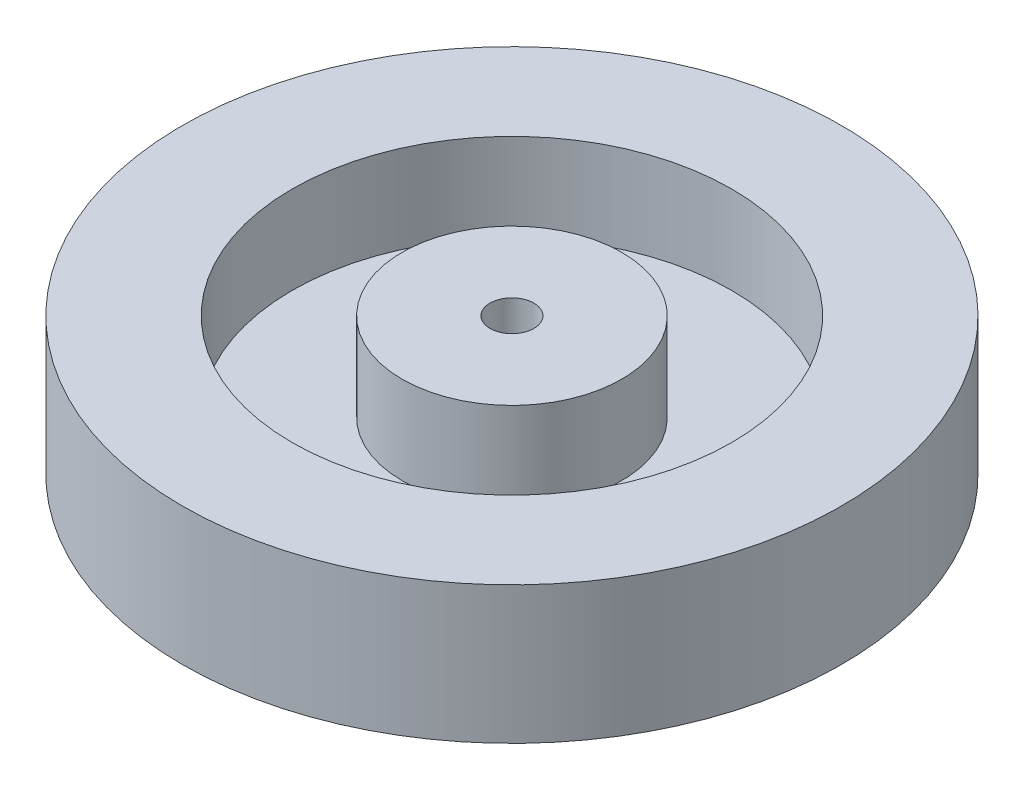
ISO-10303-21;
HEADER;
FILE_DESCRIPTION(('STEP AP214'),'2;1');
FILE_NAME('part.step','',(''),(''),'','','');
FILE_SCHEMA(('AUTOMOTIVE_DESIGN { 1 0 10303 214 1 1 1 1 }'));
ENDSEC;
DATA;
#1=APPLICATION_CONTEXT('core data for automotive mechanical design processes');
#2=APPLICATION_PROTOCOL_DEFINITION('international standard','automotive_design',2000,#1);
#3=PRODUCT_CONTEXT('',#1,'mechanical');
#4=PRODUCT('Part','Part','',(#3));
#5=PRODUCT_RELATED_PRODUCT_CATEGORY('part','',(#4));
#6=PRODUCT_DEFINITION_FORMATION('','',#4);
#7=PRODUCT_DEFINITION_CONTEXT('part definition',#1,'design');
#8=PRODUCT_DEFINITION('design','',#6,#7);
#9=PRODUCT_DEFINITION_SHAPE('','',#8);
#10=(LENGTH_UNIT() NAMED_UNIT(*) SI_UNIT(.MILLI.,.METRE.));
#11=(NAMED_UNIT(*) PLANE_ANGLE_UNIT() SI_UNIT($,.RADIAN.));
#12=(NAMED_UNIT(*) SI_UNIT($,.STERADIAN.) SOLID_ANGLE_UNIT());
#13=UNCERTAINTY_MEASURE_WITH_UNIT(LENGTH_MEASURE(1.E-05),#10,'distance_accuracy_value','');
#14=(GEOMETRIC_REPRESENTATION_CONTEXT(3) GLOBAL_UNCERTAINTY_ASSIGNED_CONTEXT((#13)) GLOBAL_UNIT_ASSIGNED_CONTEXT((#10,
#11,#12)) REPRESENTATION_CONTEXT('',''));
#15=CARTESIAN_POINT('',(0.,0.,0.));
#16=DIRECTION('',(0.,0.,1.));
#17=DIRECTION('',(1.,0.,0.));
#18=AXIS2_PLACEMENT_3D('',#15,#16,#17);
#19=CARTESIAN_POINT('',(0.,25.,0.));
#20=DIRECTION('',(0.,-1.,0.));
#21=DIRECTION('',(0.,0.,-1.));
#22=AXIS2_PLACEMENT_3D('',#19,#20,#21);
#23=CYLINDRICAL_SURFACE('',#22,60.);
#24=CARTESIAN_POINT('',(0.,25.,0.));
#25=DIRECTION('',(0.,1.,0.));
#26=DIRECTION('',(0.,0.,1.));
#27=AXIS2_PLACEMENT_3D('',#24,#25,#26);
#28=CIRCLE('',#27,60.);
#29=CARTESIAN_POINT('',(0.,25.,60.));
#30=VERTEX_POINT('',#29);
#31=EDGE_CURVE('E45',#30,#30,#28,.T.);
#32=ORIENTED_EDGE('',*,*,#31,.F.);
#33=EDGE_LOOP('',(#32));
#34=FACE_BOUND('',#33,.T.);
#35=CARTESIAN_POINT('',(0.,0.,0.));
#36=DIRECTION('',(0.,1.,0.));
#37=DIRECTION('',(0.,0.,1.));
#38=AXIS2_PLACEMENT_3D('',#35,#36,#37);
#39=CIRCLE('',#38,60.);
#40=CARTESIAN_POINT('',(0.,0.,60.));
#41=VERTEX_POINT('',#40);
#42=EDGE_CURVE('E40',#41,#41,#39,.T.);
#43=ORIENTED_EDGE('',*,*,#42,.T.);
#44=EDGE_LOOP('',(#43));
#45=FACE_BOUND('',#44,.T.);
#46=ADVANCED_FACE('F37',(#34,#45),#23,.T.);
#47=CARTESIAN_POINT('',(0.,25.,0.));
#48=DIRECTION('',(0.,1.,0.));
#49=DIRECTION('',(0.,0.,1.));
#50=AXIS2_PLACEMENT_3D('',#47,#48,#49);
#51=PLANE('',#50);
#52=CARTESIAN_POINT('',(0.,25.,0.));
#53=DIRECTION('',(0.,1.,0.));
#54=DIRECTION('',(0.,0.,1.));
#55=AXIS2_PLACEMENT_3D('',#52,#53,#54);
#56=CIRCLE('',#55,40.);
#57=CARTESIAN_POINT('',(0.,25.,40.));
#58=VERTEX_POINT('',#57);
#59=EDGE_CURVE('E59',#58,#58,#56,.T.);
#60=ORIENTED_EDGE('',*,*,#59,.F.);
#61=EDGE_LOOP('',(#60));
#62=FACE_BOUND('',#61,.T.);
#63=ORIENTED_EDGE('',*,*,#31,.T.);
#64=EDGE_LOOP('',(#63));
#65=FACE_BOUND('',#64,.T.);
#66=ADVANCED_FACE('F74',(#62,#65),#51,.T.);
#67=CARTESIAN_POINT('',(0.,0.,0.));
#68=DIRECTION('',(0.,1.,0.));
#69=DIRECTION('',(0.,0.,1.));
#70=AXIS2_PLACEMENT_3D('',#67,#68,#69);
#71=PLANE('',#70);
#72=CARTESIAN_POINT('',(0.,0.,0.));
#73=DIRECTION('',(0.,-1.,0.));
#74=DIRECTION('',(0.,0.,-1.));
#75=AXIS2_PLACEMENT_3D('',#72,#73,#74);
#76=CIRCLE('',#75,20.);
#77=CARTESIAN_POINT('',(0.,0.,-20.));
#78=VERTEX_POINT('',#77);
#79=EDGE_CURVE('E10',#78,#78,#76,.T.);
#80=ORIENTED_EDGE('',*,*,#79,.F.);
#81=EDGE_LOOP('',(#80));
#82=FACE_BOUND('',#81,.T.);
#83=ORIENTED_EDGE('',*,*,#42,.F.);
#84=EDGE_LOOP('',(#83));
#85=FACE_BOUND('',#84,.T.);
#86=ADVANCED_FACE('F77',(#82,#85),#71,.F.);
#87=CARTESIAN_POINT('',(0.,9.,0.));
#88=DIRECTION('',(0.,1.,0.));
#89=DIRECTION('',(0.,0.,1.));
#90=AXIS2_PLACEMENT_3D('',#87,#88,#89);
#91=CYLINDRICAL_SURFACE('',#90,40.);
#92=CARTESIAN_POINT('',(0.,9.,0.));
#93=DIRECTION('',(0.,1.,0.));
#94=DIRECTION('',(0.,0.,1.));
#95=AXIS2_PLACEMENT_3D('',#92,#93,#94);
#96=CIRCLE('',#95,40.);
#97=CARTESIAN_POINT('',(0.,9.,40.));
#98=VERTEX_POINT('',#97);
#99=EDGE_CURVE('E64',#98,#98,#96,.T.);
#100=ORIENTED_EDGE('',*,*,#99,.F.);
#101=EDGE_LOOP('',(#100));
#102=FACE_BOUND('',#101,.T.);
#103=ORIENTED_EDGE('',*,*,#59,.T.);
#104=EDGE_LOOP('',(#103));
#105=FACE_BOUND('',#104,.T.);
#106=ADVANCED_FACE('F72',(#102,#105),#91,.F.);
#107=CARTESIAN_POINT('',(0.,9.,0.));
#108=DIRECTION('',(0.,1.,0.));
#109=DIRECTION('',(0.,0.,1.));
#110=AXIS2_PLACEMENT_3D('',#107,#108,#109);
#111=PLANE('',#110);
#112=CARTESIAN_POINT('',(0.,9.,0.));
#113=DIRECTION('',(0.,1.,0.));
#114=DIRECTION('',(0.,0.,1.));
#115=AXIS2_PLACEMENT_3D('',#112,#113,#114);
#116=CIRCLE('',#115,20.);
#117=CARTESIAN_POINT('',(0.,9.,20.));
#118=VERTEX_POINT('',#117);
#119=EDGE_CURVE('E55',#118,#118,#116,.T.);
#120=ORIENTED_EDGE('',*,*,#119,.F.);
#121=EDGE_LOOP('',(#120));
#122=FACE_BOUND('',#121,.T.);
#123=ORIENTED_EDGE('',*,*,#99,.T.);
#124=EDGE_LOOP('',(#123));
#125=FACE_BOUND('',#124,.T.);
#126=ADVANCED_FACE('F93',(#122,#125),#111,.T.);
#127=CARTESIAN_POINT('',(0.,9.,0.));
#128=DIRECTION('',(0.,1.,0.));
#129=DIRECTION('',(0.,0.,1.));
#130=AXIS2_PLACEMENT_3D('',#127,#128,#129);
#131=CYLINDRICAL_SURFACE('',#130,20.);
#132=ORIENTED_EDGE('',*,*,#119,.T.);
#133=EDGE_LOOP('',(#132));
#134=FACE_BOUND('',#133,.T.);
#135=CARTESIAN_POINT('',(0.,25.,0.));
#136=DIRECTION('',(0.,1.,0.));
#137=DIRECTION('',(0.,0.,1.));
#138=AXIS2_PLACEMENT_3D('',#135,#136,#137);
#139=CIRCLE('',#138,20.);
#140=CARTESIAN_POINT('',(0.,25.,20.));
#141=VERTEX_POINT('',#140);
#142=EDGE_CURVE('E60',#141,#141,#139,.T.);
#143=ORIENTED_EDGE('',*,*,#142,.F.);
#144=EDGE_LOOP('',(#143));
#145=FACE_BOUND('',#144,.T.);
#146=ADVANCED_FACE('F99',(#134,#145),#131,.T.);
#147=CARTESIAN_POINT('',(0.,25.,0.));
#148=DIRECTION('',(0.,-1.,0.));
#149=DIRECTION('',(0.,0.,-1.));
#150=AXIS2_PLACEMENT_3D('',#147,#148,#149);
#151=CIRCLE('',#150,4.);
#152=CARTESIAN_POINT('',(0.,25.,-4.));
#153=VERTEX_POINT('',#152);
#154=EDGE_CURVE('E120',#153,#153,#151,.T.);
#155=ORIENTED_EDGE('',*,*,#154,.T.);
#156=EDGE_LOOP('',(#155));
#157=FACE_BOUND('',#156,.T.);
#158=ORIENTED_EDGE('',*,*,#142,.T.);
#159=EDGE_LOOP('',(#158));
#160=FACE_BOUND('',#159,.T.);
#161=ADVANCED_FACE('F79',(#157,#160),#51,.T.);
#162=CARTESIAN_POINT('',(0.,-16.,0.));
#163=DIRECTION('',(0.,1.,0.));
#164=DIRECTION('',(0.,0.,1.));
#165=AXIS2_PLACEMENT_3D('',#162,#163,#164);
#166=CYLINDRICAL_SURFACE('',#165,20.);
#167=CARTESIAN_POINT('',(0.,-16.,0.));
#168=DIRECTION('',(0.,-1.,0.));
#169=DIRECTION('',(0.,0.,-1.));
#170=AXIS2_PLACEMENT_3D('',#167,#168,#169);
#171=CIRCLE('',#170,20.);
#172=CARTESIAN_POINT('',(0.,-16.,-20.));
#173=VERTEX_POINT('',#172);
#174=EDGE_CURVE('E53',#173,#173,#171,.T.);
#175=ORIENTED_EDGE('',*,*,#174,.F.);
#176=EDGE_LOOP('',(#175));
#177=FACE_BOUND('',#176,.T.);
#178=ORIENTED_EDGE('',*,*,#79,.T.);
#179=EDGE_LOOP('',(#178));
#180=FACE_BOUND('',#179,.T.);
#181=ADVANCED_FACE('F104',(#177,#180),#166,.T.);
#182=CARTESIAN_POINT('',(0.,-16.,0.));
#183=DIRECTION('',(0.,-1.,0.));
#184=DIRECTION('',(0.,0.,-1.));
#185=AXIS2_PLACEMENT_3D('',#182,#183,#184);
#186=PLANE('',#185);
#187=CARTESIAN_POINT('',(0.,-16.,0.));
#188=DIRECTION('',(0.,-1.,0.));
#189=DIRECTION('',(0.,0.,-1.));
#190=AXIS2_PLACEMENT_3D('',#187,#188,#189);
#191=CIRCLE('',#190,4.);
#192=CARTESIAN_POINT('',(0.,-16.,-4.));
#193=VERTEX_POINT('',#192);
#194=EDGE_CURVE('E123',#193,#193,#191,.T.);
#195=ORIENTED_EDGE('',*,*,#194,.F.);
#196=EDGE_LOOP('',(#195));
#197=FACE_BOUND('',#196,.T.);
#198=ORIENTED_EDGE('',*,*,#174,.T.);
#199=EDGE_LOOP('',(#198));
#200=FACE_BOUND('',#199,.T.);
#201=ADVANCED_FACE('F107',(#197,#200),#186,.T.);
#202=CARTESIAN_POINT('',(0.,25.,0.));
#203=DIRECTION('',(0.,-1.,0.));
#204=DIRECTION('',(0.,0.,-1.));
#205=AXIS2_PLACEMENT_3D('',#202,#203,#204);
#206=CYLINDRICAL_SURFACE('',#205,4.);
#207=ORIENTED_EDGE('',*,*,#154,.F.);
#208=EDGE_LOOP('',(#207));
#209=FACE_BOUND('',#208,.T.);
#210=ORIENTED_EDGE('',*,*,#194,.T.);
#211=EDGE_LOOP('',(#210));
#212=FACE_BOUND('',#211,.T.);
#213=ADVANCED_FACE('F111',(#209,#212),#206,.F.);
#214=CLOSED_SHELL('',(#46,#66,#86,#106,#126,#146,#161,#181,#201,#213));
#215=MANIFOLD_SOLID_BREP('B2',#214);
#216=ADVANCED_BREP_SHAPE_REPRESENTATION('',(#18,#215),#14);
#217=SHAPE_DEFINITION_REPRESENTATION(#9,#216);
ENDSEC;
END-ISO-10303-21;
